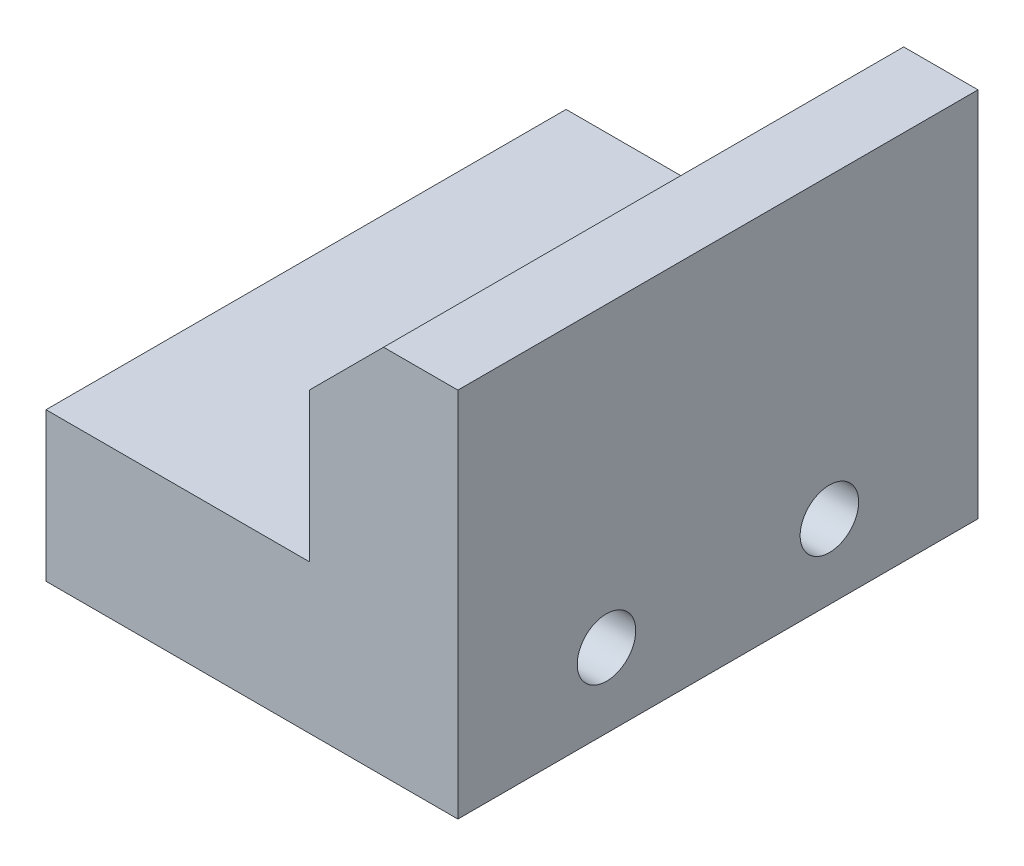
ISO-10303-21;
HEADER;
FILE_DESCRIPTION(('STEP AP214'),'2;1');
FILE_NAME('part.step','',(''),(''),'','','');
FILE_SCHEMA(('AUTOMOTIVE_DESIGN { 1 0 10303 214 1 1 1 1 }'));
ENDSEC;
DATA;
#1=APPLICATION_CONTEXT('core data for automotive mechanical design processes');
#2=APPLICATION_PROTOCOL_DEFINITION('international standard','automotive_design',2000,#1);
#3=PRODUCT_CONTEXT('',#1,'mechanical');
#4=PRODUCT('Part','Part','',(#3));
#5=PRODUCT_RELATED_PRODUCT_CATEGORY('part','',(#4));
#6=PRODUCT_DEFINITION_FORMATION('','',#4);
#7=PRODUCT_DEFINITION_CONTEXT('part definition',#1,'design');
#8=PRODUCT_DEFINITION('design','',#6,#7);
#9=PRODUCT_DEFINITION_SHAPE('','',#8);
#10=(LENGTH_UNIT() NAMED_UNIT(*) SI_UNIT(.MILLI.,.METRE.));
#11=(NAMED_UNIT(*) PLANE_ANGLE_UNIT() SI_UNIT($,.RADIAN.));
#12=(NAMED_UNIT(*) SI_UNIT($,.STERADIAN.) SOLID_ANGLE_UNIT());
#13=UNCERTAINTY_MEASURE_WITH_UNIT(LENGTH_MEASURE(1.E-05),#10,'distance_accuracy_value','');
#14=(GEOMETRIC_REPRESENTATION_CONTEXT(3) GLOBAL_UNCERTAINTY_ASSIGNED_CONTEXT((#13)) GLOBAL_UNIT_ASSIGNED_CONTEXT((#10,
#11,#12)) REPRESENTATION_CONTEXT('',''));
#15=CARTESIAN_POINT('',(0.,0.,0.));
#16=DIRECTION('',(0.,0.,1.));
#17=DIRECTION('',(1.,0.,0.));
#18=AXIS2_PLACEMENT_3D('',#15,#16,#17);
#19=CARTESIAN_POINT('',(0.,50.8,44.45));
#20=DIRECTION('',(0.,1.,0.));
#21=DIRECTION('',(0.,0.,1.));
#22=AXIS2_PLACEMENT_3D('',#19,#20,#21);
#23=PLANE('',#22);
#24=DIRECTION('',(1.,0.,0.));
#25=VECTOR('',#24,1.);
#26=CARTESIAN_POINT('',(0.,50.8,-44.45));
#27=LINE('',#26,#25);
#28=CARTESIAN_POINT('',(57.7,50.8,-44.45));
#29=VERTEX_POINT('',#28);
#30=CARTESIAN_POINT('',(70.4,50.8,-44.45));
#31=VERTEX_POINT('',#30);
#32=EDGE_CURVE('E128',#29,#31,#27,.T.);
#33=ORIENTED_EDGE('',*,*,#32,.F.);
#34=DIRECTION('',(0.,0.,-1.));
#35=VECTOR('',#34,1.);
#36=CARTESIAN_POINT('',(57.7,50.8,44.45));
#37=LINE('',#36,#35);
#38=CARTESIAN_POINT('',(57.7,50.8,44.45));
#39=VERTEX_POINT('',#38);
#40=EDGE_CURVE('E12',#39,#29,#37,.T.);
#41=ORIENTED_EDGE('',*,*,#40,.F.);
#42=DIRECTION('',(1.,0.,0.));
#43=VECTOR('',#42,1.);
#44=CARTESIAN_POINT('',(0.,50.8,44.45));
#45=LINE('',#44,#43);
#46=CARTESIAN_POINT('',(70.4,50.8,44.45));
#47=VERTEX_POINT('',#46);
#48=EDGE_CURVE('E145',#39,#47,#45,.T.);
#49=ORIENTED_EDGE('',*,*,#48,.T.);
#50=DIRECTION('',(0.,0.,-1.));
#51=VECTOR('',#50,1.);
#52=CARTESIAN_POINT('',(70.4,50.8,44.45));
#53=LINE('',#52,#51);
#54=EDGE_CURVE('E55',#47,#31,#53,.T.);
#55=ORIENTED_EDGE('',*,*,#54,.T.);
#56=EDGE_LOOP('',(#33,#41,#49,#55));
#57=FACE_BOUND('',#56,.T.);
#58=ADVANCED_FACE('F37',(#57),#23,.T.);
#59=CARTESIAN_POINT('',(3.45000000000001,-3.45000000000001,44.45));
#60=DIRECTION('',(0.707106781186548,-0.707106781186547,0.));
#61=DIRECTION('',(0.707106781186547,0.707106781186548,0.));
#62=AXIS2_PLACEMENT_3D('',#59,#60,#61);
#63=PLANE('',#62);
#64=DIRECTION('',(-0.707106781186547,-0.707106781186548,0.));
#65=VECTOR('',#64,1.);
#66=CARTESIAN_POINT('',(3.45000000000001,-3.45000000000001,-44.45));
#67=LINE('',#66,#65);
#68=CARTESIAN_POINT('',(45.,38.1,-44.45));
#69=VERTEX_POINT('',#68);
#70=EDGE_CURVE('E130',#29,#69,#67,.T.);
#71=ORIENTED_EDGE('',*,*,#70,.T.);
#72=DIRECTION('',(0.,0.,-1.));
#73=VECTOR('',#72,1.);
#74=CARTESIAN_POINT('',(45.,38.1,44.45));
#75=LINE('',#74,#73);
#76=CARTESIAN_POINT('',(45.,38.1,44.45));
#77=VERTEX_POINT('',#76);
#78=EDGE_CURVE('E46',#77,#69,#75,.T.);
#79=ORIENTED_EDGE('',*,*,#78,.F.);
#80=DIRECTION('',(-0.707106781186547,-0.707106781186548,0.));
#81=VECTOR('',#80,1.);
#82=CARTESIAN_POINT('',(3.45000000000001,-3.45000000000001,44.45));
#83=LINE('',#82,#81);
#84=EDGE_CURVE('E178',#39,#77,#83,.T.);
#85=ORIENTED_EDGE('',*,*,#84,.F.);
#86=ORIENTED_EDGE('',*,*,#40,.T.);
#87=EDGE_LOOP('',(#71,#79,#85,#86));
#88=FACE_BOUND('',#87,.T.);
#89=ADVANCED_FACE('F205',(#88),#63,.F.);
#90=CARTESIAN_POINT('',(45.,0.,44.45));
#91=DIRECTION('',(1.,0.,0.));
#92=DIRECTION('',(0.,1.,0.));
#93=AXIS2_PLACEMENT_3D('',#90,#91,#92);
#94=PLANE('',#93);
#95=DIRECTION('',(0.,-1.,0.));
#96=VECTOR('',#95,1.);
#97=CARTESIAN_POINT('',(45.,0.,-44.45));
#98=LINE('',#97,#96);
#99=CARTESIAN_POINT('',(45.,12.7,-44.45));
#100=VERTEX_POINT('',#99);
#101=EDGE_CURVE('E133',#69,#100,#98,.T.);
#102=ORIENTED_EDGE('',*,*,#101,.T.);
#103=DIRECTION('',(0.,0.,-1.));
#104=VECTOR('',#103,1.);
#105=CARTESIAN_POINT('',(45.,12.7,44.45));
#106=LINE('',#105,#104);
#107=CARTESIAN_POINT('',(45.,12.7,44.45));
#108=VERTEX_POINT('',#107);
#109=EDGE_CURVE('E149',#108,#100,#106,.T.);
#110=ORIENTED_EDGE('',*,*,#109,.F.);
#111=DIRECTION('',(0.,-1.,0.));
#112=VECTOR('',#111,1.);
#113=CARTESIAN_POINT('',(45.,0.,44.45));
#114=LINE('',#113,#112);
#115=EDGE_CURVE('E123',#77,#108,#114,.T.);
#116=ORIENTED_EDGE('',*,*,#115,.F.);
#117=ORIENTED_EDGE('',*,*,#78,.T.);
#118=EDGE_LOOP('',(#102,#110,#116,#117));
#119=FACE_BOUND('',#118,.T.);
#120=ADVANCED_FACE('F183',(#119),#94,.F.);
#121=CARTESIAN_POINT('',(0.,12.7,44.45));
#122=DIRECTION('',(0.,1.,0.));
#123=DIRECTION('',(0.,0.,1.));
#124=AXIS2_PLACEMENT_3D('',#121,#122,#123);
#125=PLANE('',#124);
#126=DIRECTION('',(1.,0.,0.));
#127=VECTOR('',#126,1.);
#128=CARTESIAN_POINT('',(0.,12.7,-44.45));
#129=LINE('',#128,#127);
#130=CARTESIAN_POINT('',(0.,12.7,-44.45));
#131=VERTEX_POINT('',#130);
#132=EDGE_CURVE('E136',#131,#100,#129,.T.);
#133=ORIENTED_EDGE('',*,*,#132,.F.);
#134=DIRECTION('',(0.,0.,-1.));
#135=VECTOR('',#134,1.);
#136=CARTESIAN_POINT('',(0.,12.7,44.45));
#137=LINE('',#136,#135);
#138=CARTESIAN_POINT('',(0.,12.7,44.45));
#139=VERTEX_POINT('',#138);
#140=EDGE_CURVE('E109',#139,#131,#137,.T.);
#141=ORIENTED_EDGE('',*,*,#140,.F.);
#142=DIRECTION('',(1.,0.,0.));
#143=VECTOR('',#142,1.);
#144=CARTESIAN_POINT('',(0.,12.7,44.45));
#145=LINE('',#144,#143);
#146=EDGE_CURVE('E121',#139,#108,#145,.T.);
#147=ORIENTED_EDGE('',*,*,#146,.T.);
#148=ORIENTED_EDGE('',*,*,#109,.T.);
#149=EDGE_LOOP('',(#133,#141,#147,#148));
#150=FACE_BOUND('',#149,.T.);
#151=ADVANCED_FACE('F187',(#150),#125,.T.);
#152=CARTESIAN_POINT('',(0.,0.,44.45));
#153=DIRECTION('',(-1.,0.,0.));
#154=DIRECTION('',(0.,0.,1.));
#155=AXIS2_PLACEMENT_3D('',#152,#153,#154);
#156=PLANE('',#155);
#157=CARTESIAN_POINT('',(0.,0.,19.05));
#158=DIRECTION('',(1.,0.,0.));
#159=DIRECTION('',(0.,0.,-1.));
#160=AXIS2_PLACEMENT_3D('',#157,#158,#159);
#161=CIRCLE('',#160,2.8);
#162=CARTESIAN_POINT('',(0.,0.,16.25));
#163=VERTEX_POINT('',#162);
#164=EDGE_CURVE('E131',#163,#163,#161,.T.);
#165=ORIENTED_EDGE('',*,*,#164,.T.);
#166=EDGE_LOOP('',(#165));
#167=FACE_BOUND('',#166,.T.);
#168=CARTESIAN_POINT('',(0.,0.,-19.05));
#169=DIRECTION('',(1.,0.,0.));
#170=DIRECTION('',(0.,0.,-1.));
#171=AXIS2_PLACEMENT_3D('',#168,#169,#170);
#172=CIRCLE('',#171,2.8);
#173=CARTESIAN_POINT('',(0.,0.,-21.85));
#174=VERTEX_POINT('',#173);
#175=EDGE_CURVE('E158',#174,#174,#172,.T.);
#176=ORIENTED_EDGE('',*,*,#175,.T.);
#177=EDGE_LOOP('',(#176));
#178=FACE_BOUND('',#177,.T.);
#179=DIRECTION('',(0.,1.,0.));
#180=VECTOR('',#179,1.);
#181=CARTESIAN_POINT('',(0.,0.,-44.45));
#182=LINE('',#181,#180);
#183=CARTESIAN_POINT('',(0.,-12.7,-44.45));
#184=VERTEX_POINT('',#183);
#185=EDGE_CURVE('E106',#184,#131,#182,.T.);
#186=ORIENTED_EDGE('',*,*,#185,.F.);
#187=DIRECTION('',(0.,0.,-1.));
#188=VECTOR('',#187,1.);
#189=CARTESIAN_POINT('',(0.,-12.7,44.45));
#190=LINE('',#189,#188);
#191=CARTESIAN_POINT('',(0.,-12.7,44.45));
#192=VERTEX_POINT('',#191);
#193=EDGE_CURVE('E100',#192,#184,#190,.T.);
#194=ORIENTED_EDGE('',*,*,#193,.F.);
#195=DIRECTION('',(0.,1.,0.));
#196=VECTOR('',#195,1.);
#197=CARTESIAN_POINT('',(0.,0.,44.45));
#198=LINE('',#197,#196);
#199=EDGE_CURVE('E104',#192,#139,#198,.T.);
#200=ORIENTED_EDGE('',*,*,#199,.T.);
#201=ORIENTED_EDGE('',*,*,#140,.T.);
#202=EDGE_LOOP('',(#186,#194,#200,#201));
#203=FACE_BOUND('',#202,.T.);
#204=ADVANCED_FACE('F102',(#167,#178,#203),#156,.T.);
#205=CARTESIAN_POINT('',(0.,-12.7,44.45));
#206=DIRECTION('',(0.,1.,0.));
#207=DIRECTION('',(0.,0.,1.));
#208=AXIS2_PLACEMENT_3D('',#205,#206,#207);
#209=PLANE('',#208);
#210=DIRECTION('',(1.,0.,0.));
#211=VECTOR('',#210,1.);
#212=CARTESIAN_POINT('',(0.,-12.7,-44.45));
#213=LINE('',#212,#211);
#214=CARTESIAN_POINT('',(70.4,-12.7,-44.45));
#215=VERTEX_POINT('',#214);
#216=EDGE_CURVE('E140',#184,#215,#213,.T.);
#217=ORIENTED_EDGE('',*,*,#216,.T.);
#218=DIRECTION('',(0.,0.,-1.));
#219=VECTOR('',#218,1.);
#220=CARTESIAN_POINT('',(70.4,-12.7,44.45));
#221=LINE('',#220,#219);
#222=CARTESIAN_POINT('',(70.4,-12.7,44.45));
#223=VERTEX_POINT('',#222);
#224=EDGE_CURVE('E78',#223,#215,#221,.T.);
#225=ORIENTED_EDGE('',*,*,#224,.F.);
#226=DIRECTION('',(1.,0.,0.));
#227=VECTOR('',#226,1.);
#228=CARTESIAN_POINT('',(0.,-12.7,44.45));
#229=LINE('',#228,#227);
#230=EDGE_CURVE('E111',#192,#223,#229,.T.);
#231=ORIENTED_EDGE('',*,*,#230,.F.);
#232=ORIENTED_EDGE('',*,*,#193,.T.);
#233=EDGE_LOOP('',(#217,#225,#231,#232));
#234=FACE_BOUND('',#233,.T.);
#235=ADVANCED_FACE('F112',(#234),#209,.F.);
#236=CARTESIAN_POINT('',(70.4,0.,44.45));
#237=DIRECTION('',(1.,0.,0.));
#238=DIRECTION('',(0.,1.,0.));
#239=AXIS2_PLACEMENT_3D('',#236,#237,#238);
#240=PLANE('',#239);
#241=CARTESIAN_POINT('',(70.4,0.,19.05));
#242=DIRECTION('',(1.,0.,0.));
#243=DIRECTION('',(0.,0.,-1.));
#244=AXIS2_PLACEMENT_3D('',#241,#242,#243);
#245=CIRCLE('',#244,5.);
#246=CARTESIAN_POINT('',(70.4,0.,14.05));
#247=VERTEX_POINT('',#246);
#248=EDGE_CURVE('E160',#247,#247,#245,.T.);
#249=ORIENTED_EDGE('',*,*,#248,.F.);
#250=EDGE_LOOP('',(#249));
#251=FACE_BOUND('',#250,.T.);
#252=CARTESIAN_POINT('',(70.4,0.,-19.05));
#253=DIRECTION('',(1.,0.,0.));
#254=DIRECTION('',(0.,0.,-1.));
#255=AXIS2_PLACEMENT_3D('',#252,#253,#254);
#256=CIRCLE('',#255,5.);
#257=CARTESIAN_POINT('',(70.4,0.,-24.05));
#258=VERTEX_POINT('',#257);
#259=EDGE_CURVE('E168',#258,#258,#256,.T.);
#260=ORIENTED_EDGE('',*,*,#259,.F.);
#261=EDGE_LOOP('',(#260));
#262=FACE_BOUND('',#261,.T.);
#263=DIRECTION('',(0.,-1.,0.));
#264=VECTOR('',#263,1.);
#265=CARTESIAN_POINT('',(70.4,0.,-44.45));
#266=LINE('',#265,#264);
#267=EDGE_CURVE('E142',#31,#215,#266,.T.);
#268=ORIENTED_EDGE('',*,*,#267,.F.);
#269=ORIENTED_EDGE('',*,*,#54,.F.);
#270=DIRECTION('',(0.,-1.,0.));
#271=VECTOR('',#270,1.);
#272=CARTESIAN_POINT('',(70.4,0.,44.45));
#273=LINE('',#272,#271);
#274=EDGE_CURVE('E115',#47,#223,#273,.T.);
#275=ORIENTED_EDGE('',*,*,#274,.T.);
#276=ORIENTED_EDGE('',*,*,#224,.T.);
#277=EDGE_LOOP('',(#268,#269,#275,#276));
#278=FACE_BOUND('',#277,.T.);
#279=ADVANCED_FACE('F191',(#251,#262,#278),#240,.T.);
#280=CARTESIAN_POINT('',(0.,0.,44.45));
#281=DIRECTION('',(0.,0.,1.));
#282=DIRECTION('',(1.,0.,0.));
#283=AXIS2_PLACEMENT_3D('',#280,#281,#282);
#284=PLANE('',#283);
#285=ORIENTED_EDGE('',*,*,#48,.F.);
#286=ORIENTED_EDGE('',*,*,#84,.T.);
#287=ORIENTED_EDGE('',*,*,#115,.T.);
#288=ORIENTED_EDGE('',*,*,#146,.F.);
#289=ORIENTED_EDGE('',*,*,#199,.F.);
#290=ORIENTED_EDGE('',*,*,#230,.T.);
#291=ORIENTED_EDGE('',*,*,#274,.F.);
#292=EDGE_LOOP('',(#285,#286,#287,#288,#289,#290,#291));
#293=FACE_BOUND('',#292,.T.);
#294=ADVANCED_FACE('F119',(#293),#284,.T.);
#295=CARTESIAN_POINT('',(0.,0.,-44.45));
#296=DIRECTION('',(0.,0.,1.));
#297=DIRECTION('',(1.,0.,0.));
#298=AXIS2_PLACEMENT_3D('',#295,#296,#297);
#299=PLANE('',#298);
#300=ORIENTED_EDGE('',*,*,#32,.T.);
#301=ORIENTED_EDGE('',*,*,#267,.T.);
#302=ORIENTED_EDGE('',*,*,#216,.F.);
#303=ORIENTED_EDGE('',*,*,#185,.T.);
#304=ORIENTED_EDGE('',*,*,#132,.T.);
#305=ORIENTED_EDGE('',*,*,#101,.F.);
#306=ORIENTED_EDGE('',*,*,#70,.F.);
#307=EDGE_LOOP('',(#300,#301,#302,#303,#304,#305,#306));
#308=FACE_BOUND('',#307,.T.);
#309=ADVANCED_FACE('F189',(#308),#299,.F.);
#310=CARTESIAN_POINT('',(0.,0.,-19.05));
#311=DIRECTION('',(1.,0.,0.));
#312=DIRECTION('',(0.,0.,-1.));
#313=AXIS2_PLACEMENT_3D('',#310,#311,#312);
#314=CYLINDRICAL_SURFACE('',#313,2.8);
#315=CARTESIAN_POINT('',(10.,0.,-19.05));
#316=DIRECTION('',(-1.,0.,0.));
#317=DIRECTION('',(0.,0.,1.));
#318=AXIS2_PLACEMENT_3D('',#315,#316,#317);
#319=CIRCLE('',#318,2.8);
#320=CARTESIAN_POINT('',(10.,0.,-16.25));
#321=VERTEX_POINT('',#320);
#322=EDGE_CURVE('E40',#321,#321,#319,.F.);
#323=ORIENTED_EDGE('',*,*,#322,.T.);
#324=EDGE_LOOP('',(#323));
#325=FACE_BOUND('',#324,.T.);
#326=ORIENTED_EDGE('',*,*,#175,.F.);
#327=EDGE_LOOP('',(#326));
#328=FACE_BOUND('',#327,.T.);
#329=ADVANCED_FACE('F225',(#325,#328),#314,.F.);
#330=CARTESIAN_POINT('',(0.,0.,19.05));
#331=DIRECTION('',(1.,0.,0.));
#332=DIRECTION('',(0.,0.,-1.));
#333=AXIS2_PLACEMENT_3D('',#330,#331,#332);
#334=CYLINDRICAL_SURFACE('',#333,2.8);
#335=CARTESIAN_POINT('',(10.,0.,19.05));
#336=DIRECTION('',(-1.,0.,0.));
#337=DIRECTION('',(0.,0.,1.));
#338=AXIS2_PLACEMENT_3D('',#335,#336,#337);
#339=CIRCLE('',#338,2.8);
#340=CARTESIAN_POINT('',(10.,0.,21.85));
#341=VERTEX_POINT('',#340);
#342=EDGE_CURVE('E152',#341,#341,#339,.F.);
#343=ORIENTED_EDGE('',*,*,#342,.T.);
#344=EDGE_LOOP('',(#343));
#345=FACE_BOUND('',#344,.T.);
#346=ORIENTED_EDGE('',*,*,#164,.F.);
#347=EDGE_LOOP('',(#346));
#348=FACE_BOUND('',#347,.T.);
#349=ADVANCED_FACE('F227',(#345,#348),#334,.F.);
#350=CARTESIAN_POINT('',(10.,0.,44.45));
#351=DIRECTION('',(-1.,0.,0.));
#352=DIRECTION('',(0.,0.,1.));
#353=AXIS2_PLACEMENT_3D('',#350,#351,#352);
#354=PLANE('',#353);
#355=CARTESIAN_POINT('',(10.,0.,19.05));
#356=DIRECTION('',(-1.,0.,0.));
#357=DIRECTION('',(0.,0.,1.));
#358=AXIS2_PLACEMENT_3D('',#355,#356,#357);
#359=CIRCLE('',#358,5.);
#360=CARTESIAN_POINT('',(10.,0.,24.05));
#361=VERTEX_POINT('',#360);
#362=EDGE_CURVE('E154',#361,#361,#359,.F.);
#363=ORIENTED_EDGE('',*,*,#362,.T.);
#364=EDGE_LOOP('',(#363));
#365=FACE_BOUND('',#364,.T.);
#366=ORIENTED_EDGE('',*,*,#342,.F.);
#367=EDGE_LOOP('',(#366));
#368=FACE_BOUND('',#367,.T.);
#369=ADVANCED_FACE('F234',(#365,#368),#354,.F.);
#370=CARTESIAN_POINT('',(-14.1421356237309,0.,19.05));
#371=DIRECTION('',(1.,0.,0.));
#372=DIRECTION('',(0.,0.,-1.));
#373=AXIS2_PLACEMENT_3D('',#370,#371,#372);
#374=CYLINDRICAL_SURFACE('',#373,5.);
#375=ORIENTED_EDGE('',*,*,#248,.T.);
#376=EDGE_LOOP('',(#375));
#377=FACE_BOUND('',#376,.T.);
#378=ORIENTED_EDGE('',*,*,#362,.F.);
#379=EDGE_LOOP('',(#378));
#380=FACE_BOUND('',#379,.T.);
#381=ADVANCED_FACE('F241',(#377,#380),#374,.F.);
#382=CARTESIAN_POINT('',(10.,0.,44.45));
#383=DIRECTION('',(-1.,0.,0.));
#384=DIRECTION('',(0.,0.,1.));
#385=AXIS2_PLACEMENT_3D('',#382,#383,#384);
#386=PLANE('',#385);
#387=CARTESIAN_POINT('',(10.,0.,-19.05));
#388=DIRECTION('',(-1.,0.,0.));
#389=DIRECTION('',(0.,0.,1.));
#390=AXIS2_PLACEMENT_3D('',#387,#388,#389);
#391=CIRCLE('',#390,5.);
#392=CARTESIAN_POINT('',(10.,0.,-14.05));
#393=VERTEX_POINT('',#392);
#394=EDGE_CURVE('E165',#393,#393,#391,.F.);
#395=ORIENTED_EDGE('',*,*,#394,.T.);
#396=EDGE_LOOP('',(#395));
#397=FACE_BOUND('',#396,.T.);
#398=ORIENTED_EDGE('',*,*,#322,.F.);
#399=EDGE_LOOP('',(#398));
#400=FACE_BOUND('',#399,.T.);
#401=ADVANCED_FACE('F237',(#397,#400),#386,.F.);
#402=CARTESIAN_POINT('',(-14.1421356237309,0.,-19.05));
#403=DIRECTION('',(1.,0.,0.));
#404=DIRECTION('',(0.,0.,-1.));
#405=AXIS2_PLACEMENT_3D('',#402,#403,#404);
#406=CYLINDRICAL_SURFACE('',#405,5.);
#407=ORIENTED_EDGE('',*,*,#259,.T.);
#408=EDGE_LOOP('',(#407));
#409=FACE_BOUND('',#408,.T.);
#410=ORIENTED_EDGE('',*,*,#394,.F.);
#411=EDGE_LOOP('',(#410));
#412=FACE_BOUND('',#411,.T.);
#413=ADVANCED_FACE('F240',(#409,#412),#406,.F.);
#414=CLOSED_SHELL('',(#58,#89,#120,#151,#204,#235,#279,#294,#309,#329,#349,#369,#381,#401,#413));
#415=MANIFOLD_SOLID_BREP('B2',#414);
#416=ADVANCED_BREP_SHAPE_REPRESENTATION('',(#18,#415),#14);
#417=SHAPE_DEFINITION_REPRESENTATION(#9,#416);
ENDSEC;
END-ISO-10303-21;
